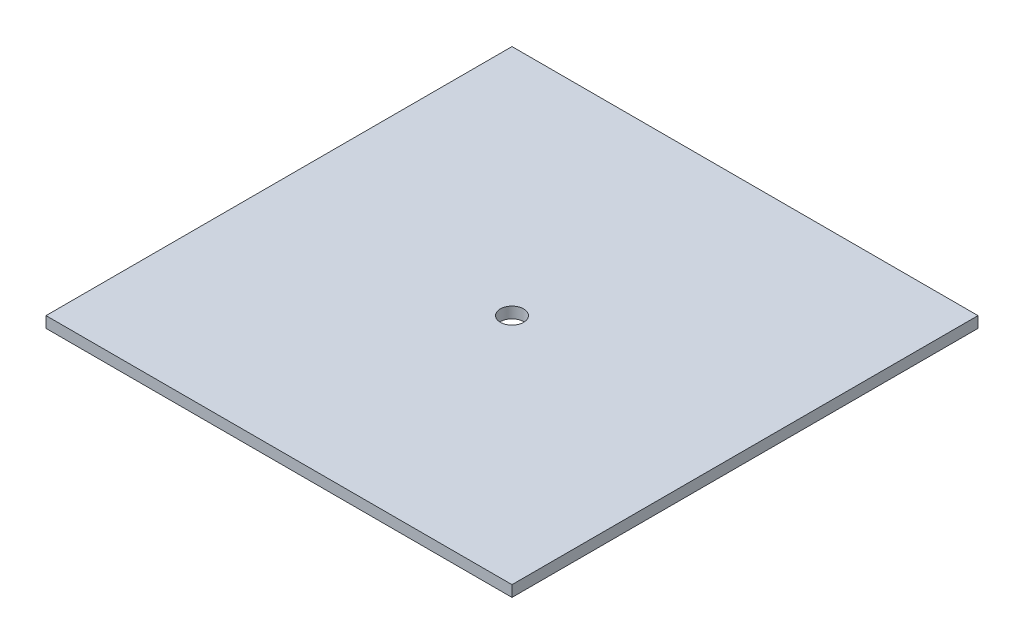
ISO-10303-21;
HEADER;
FILE_DESCRIPTION(('STEP AP214'),'2;1');
FILE_NAME('part.step','',(''),(''),'','','');
FILE_SCHEMA(('AUTOMOTIVE_DESIGN { 1 0 10303 214 1 1 1 1 }'));
ENDSEC;
DATA;
#1=APPLICATION_CONTEXT('core data for automotive mechanical design processes');
#2=APPLICATION_PROTOCOL_DEFINITION('international standard','automotive_design',2000,#1);
#3=PRODUCT_CONTEXT('',#1,'mechanical');
#4=PRODUCT('Part','Part','',(#3));
#5=PRODUCT_RELATED_PRODUCT_CATEGORY('part','',(#4));
#6=PRODUCT_DEFINITION_FORMATION('','',#4);
#7=PRODUCT_DEFINITION_CONTEXT('part definition',#1,'design');
#8=PRODUCT_DEFINITION('design','',#6,#7);
#9=PRODUCT_DEFINITION_SHAPE('','',#8);
#10=(LENGTH_UNIT() NAMED_UNIT(*) SI_UNIT(.MILLI.,.METRE.));
#11=(NAMED_UNIT(*) PLANE_ANGLE_UNIT() SI_UNIT($,.RADIAN.));
#12=(NAMED_UNIT(*) SI_UNIT($,.STERADIAN.) SOLID_ANGLE_UNIT());
#13=UNCERTAINTY_MEASURE_WITH_UNIT(LENGTH_MEASURE(1.E-05),#10,'distance_accuracy_value','');
#14=(GEOMETRIC_REPRESENTATION_CONTEXT(3) GLOBAL_UNCERTAINTY_ASSIGNED_CONTEXT((#13)) GLOBAL_UNIT_ASSIGNED_CONTEXT((#10,
#11,#12)) REPRESENTATION_CONTEXT('',''));
#15=CARTESIAN_POINT('',(0.,0.,0.));
#16=DIRECTION('',(0.,0.,1.));
#17=DIRECTION('',(1.,0.,0.));
#18=AXIS2_PLACEMENT_3D('',#15,#16,#17);
#19=CARTESIAN_POINT('',(0.,4.7625,0.));
#20=DIRECTION('',(0.,1.,0.));
#21=DIRECTION('',(0.,0.,1.));
#22=AXIS2_PLACEMENT_3D('',#19,#20,#21);
#23=PLANE('',#22);
#24=DIRECTION('',(0.,0.,1.));
#25=VECTOR('',#24,1.);
#26=CARTESIAN_POINT('',(-200.,4.7625,-200.));
#27=LINE('',#26,#25);
#28=CARTESIAN_POINT('',(-200.,4.7625,-200.));
#29=VERTEX_POINT('',#28);
#30=CARTESIAN_POINT('',(-200.,4.7625,0.));
#31=VERTEX_POINT('',#30);
#32=EDGE_CURVE('E85',#29,#31,#27,.T.);
#33=ORIENTED_EDGE('',*,*,#32,.T.);
#34=DIRECTION('',(1.,0.,0.));
#35=VECTOR('',#34,1.);
#36=CARTESIAN_POINT('',(-200.,4.7625,0.));
#37=LINE('',#36,#35);
#38=CARTESIAN_POINT('',(0.,4.7625,0.));
#39=VERTEX_POINT('',#38);
#40=EDGE_CURVE('E80',#31,#39,#37,.T.);
#41=ORIENTED_EDGE('',*,*,#40,.T.);
#42=DIRECTION('',(0.,0.,-1.));
#43=VECTOR('',#42,1.);
#44=CARTESIAN_POINT('',(0.,4.7625,-200.));
#45=LINE('',#44,#43);
#46=CARTESIAN_POINT('',(0.,4.7625,-200.));
#47=VERTEX_POINT('',#46);
#48=EDGE_CURVE('E83',#39,#47,#45,.T.);
#49=ORIENTED_EDGE('',*,*,#48,.T.);
#50=DIRECTION('',(-1.,0.,0.));
#51=VECTOR('',#50,1.);
#52=CARTESIAN_POINT('',(-200.,4.7625,-200.));
#53=LINE('',#52,#51);
#54=EDGE_CURVE('E50',#47,#29,#53,.T.);
#55=ORIENTED_EDGE('',*,*,#54,.T.);
#56=EDGE_LOOP('',(#33,#41,#49,#55));
#57=FACE_BOUND('',#56,.T.);
#58=CARTESIAN_POINT('',(-100.,4.7625,-100.));
#59=DIRECTION('',(0.,1.,0.));
#60=DIRECTION('',(0.,0.,1.));
#61=AXIS2_PLACEMENT_3D('',#58,#59,#60);
#62=CIRCLE('',#61,5.00000000000001);
#63=CARTESIAN_POINT('',(-100.,4.7625,-105.));
#64=VERTEX_POINT('',#63);
#65=EDGE_CURVE('E100',#64,#64,#62,.T.);
#66=ORIENTED_EDGE('',*,*,#65,.F.);
#67=EDGE_LOOP('',(#66));
#68=FACE_BOUND('',#67,.T.);
#69=ADVANCED_FACE('F33',(#57,#68),#23,.T.);
#70=CARTESIAN_POINT('',(0.,0.,0.));
#71=DIRECTION('',(0.,1.,0.));
#72=DIRECTION('',(0.,0.,1.));
#73=AXIS2_PLACEMENT_3D('',#70,#71,#72);
#74=PLANE('',#73);
#75=DIRECTION('',(0.,0.,1.));
#76=VECTOR('',#75,1.);
#77=CARTESIAN_POINT('',(-200.,0.,-200.));
#78=LINE('',#77,#76);
#79=CARTESIAN_POINT('',(-200.,0.,-200.));
#80=VERTEX_POINT('',#79);
#81=CARTESIAN_POINT('',(-200.,0.,0.));
#82=VERTEX_POINT('',#81);
#83=EDGE_CURVE('E97',#80,#82,#78,.T.);
#84=ORIENTED_EDGE('',*,*,#83,.F.);
#85=DIRECTION('',(-1.,0.,0.));
#86=VECTOR('',#85,1.);
#87=CARTESIAN_POINT('',(-200.,0.,-200.));
#88=LINE('',#87,#86);
#89=CARTESIAN_POINT('',(0.,0.,-200.));
#90=VERTEX_POINT('',#89);
#91=EDGE_CURVE('E73',#90,#80,#88,.T.);
#92=ORIENTED_EDGE('',*,*,#91,.F.);
#93=DIRECTION('',(0.,0.,-1.));
#94=VECTOR('',#93,1.);
#95=CARTESIAN_POINT('',(0.,0.,-200.));
#96=LINE('',#95,#94);
#97=CARTESIAN_POINT('',(0.,0.,0.));
#98=VERTEX_POINT('',#97);
#99=EDGE_CURVE('E67',#98,#90,#96,.T.);
#100=ORIENTED_EDGE('',*,*,#99,.F.);
#101=DIRECTION('',(1.,0.,0.));
#102=VECTOR('',#101,1.);
#103=CARTESIAN_POINT('',(-200.,0.,0.));
#104=LINE('',#103,#102);
#105=EDGE_CURVE('E89',#82,#98,#104,.T.);
#106=ORIENTED_EDGE('',*,*,#105,.F.);
#107=EDGE_LOOP('',(#84,#92,#100,#106));
#108=FACE_BOUND('',#107,.T.);
#109=CARTESIAN_POINT('',(-100.,0.,-100.));
#110=DIRECTION('',(0.,1.,0.));
#111=DIRECTION('',(0.,0.,1.));
#112=AXIS2_PLACEMENT_3D('',#109,#110,#111);
#113=CIRCLE('',#112,5.00000000000001);
#114=CARTESIAN_POINT('',(-100.,0.,-105.));
#115=VERTEX_POINT('',#114);
#116=EDGE_CURVE('E112',#115,#115,#113,.T.);
#117=ORIENTED_EDGE('',*,*,#116,.T.);
#118=EDGE_LOOP('',(#117));
#119=FACE_BOUND('',#118,.T.);
#120=ADVANCED_FACE('F108',(#108,#119),#74,.F.);
#121=CARTESIAN_POINT('',(-200.,4.7625,-200.));
#122=DIRECTION('',(1.,0.,0.));
#123=DIRECTION('',(0.,0.,-1.));
#124=AXIS2_PLACEMENT_3D('',#121,#122,#123);
#125=PLANE('',#124);
#126=ORIENTED_EDGE('',*,*,#83,.T.);
#127=DIRECTION('',(0.,-1.,0.));
#128=VECTOR('',#127,1.);
#129=CARTESIAN_POINT('',(-200.,4.7625,0.));
#130=LINE('',#129,#128);
#131=EDGE_CURVE('E11',#31,#82,#130,.T.);
#132=ORIENTED_EDGE('',*,*,#131,.F.);
#133=ORIENTED_EDGE('',*,*,#32,.F.);
#134=DIRECTION('',(0.,-1.,0.));
#135=VECTOR('',#134,1.);
#136=CARTESIAN_POINT('',(-200.,4.7625,-200.));
#137=LINE('',#136,#135);
#138=EDGE_CURVE('E93',#29,#80,#137,.T.);
#139=ORIENTED_EDGE('',*,*,#138,.T.);
#140=EDGE_LOOP('',(#126,#132,#133,#139));
#141=FACE_BOUND('',#140,.T.);
#142=ADVANCED_FACE('F35',(#141),#125,.F.);
#143=CARTESIAN_POINT('',(-200.,4.7625,0.));
#144=DIRECTION('',(0.,0.,-1.));
#145=DIRECTION('',(-1.,0.,0.));
#146=AXIS2_PLACEMENT_3D('',#143,#144,#145);
#147=PLANE('',#146);
#148=ORIENTED_EDGE('',*,*,#105,.T.);
#149=DIRECTION('',(0.,-1.,0.));
#150=VECTOR('',#149,1.);
#151=CARTESIAN_POINT('',(0.,4.7625,0.));
#152=LINE('',#151,#150);
#153=EDGE_CURVE('E42',#39,#98,#152,.T.);
#154=ORIENTED_EDGE('',*,*,#153,.F.);
#155=ORIENTED_EDGE('',*,*,#40,.F.);
#156=ORIENTED_EDGE('',*,*,#131,.T.);
#157=EDGE_LOOP('',(#148,#154,#155,#156));
#158=FACE_BOUND('',#157,.T.);
#159=ADVANCED_FACE('F88',(#158),#147,.F.);
#160=CARTESIAN_POINT('',(0.,4.7625,-200.));
#161=DIRECTION('',(-1.,0.,0.));
#162=DIRECTION('',(0.,0.,1.));
#163=AXIS2_PLACEMENT_3D('',#160,#161,#162);
#164=PLANE('',#163);
#165=ORIENTED_EDGE('',*,*,#99,.T.);
#166=DIRECTION('',(0.,-1.,0.));
#167=VECTOR('',#166,1.);
#168=CARTESIAN_POINT('',(0.,4.7625,-200.));
#169=LINE('',#168,#167);
#170=EDGE_CURVE('E90',#47,#90,#169,.T.);
#171=ORIENTED_EDGE('',*,*,#170,.F.);
#172=ORIENTED_EDGE('',*,*,#48,.F.);
#173=ORIENTED_EDGE('',*,*,#153,.T.);
#174=EDGE_LOOP('',(#165,#171,#172,#173));
#175=FACE_BOUND('',#174,.T.);
#176=ADVANCED_FACE('F91',(#175),#164,.F.);
#177=CARTESIAN_POINT('',(-200.,4.7625,-200.));
#178=DIRECTION('',(0.,0.,1.));
#179=DIRECTION('',(1.,0.,0.));
#180=AXIS2_PLACEMENT_3D('',#177,#178,#179);
#181=PLANE('',#180);
#182=ORIENTED_EDGE('',*,*,#91,.T.);
#183=ORIENTED_EDGE('',*,*,#138,.F.);
#184=ORIENTED_EDGE('',*,*,#54,.F.);
#185=ORIENTED_EDGE('',*,*,#170,.T.);
#186=EDGE_LOOP('',(#182,#183,#184,#185));
#187=FACE_BOUND('',#186,.T.);
#188=ADVANCED_FACE('F105',(#187),#181,.F.);
#189=CARTESIAN_POINT('',(-100.,4.7625,-100.));
#190=DIRECTION('',(0.,-1.,0.));
#191=DIRECTION('',(0.,0.,-1.));
#192=AXIS2_PLACEMENT_3D('',#189,#190,#191);
#193=CYLINDRICAL_SURFACE('',#192,5.00000000000001);
#194=CARTESIAN_POINT('',(-100.,4.7625,-105.));
#195=CARTESIAN_POINT('',(-100.,4.712890625,-105.));
#196=CARTESIAN_POINT('',(-100.,4.66328125,-105.));
#197=CARTESIAN_POINT('',(-100.,4.5640625,-105.));
#198=CARTESIAN_POINT('',(-100.,4.514453125,-105.));
#199=CARTESIAN_POINT('',(-100.,4.415234375,-105.));
#200=CARTESIAN_POINT('',(-100.,4.365625,-105.));
#201=CARTESIAN_POINT('',(-100.,4.26640625,-105.));
#202=CARTESIAN_POINT('',(-100.,4.216796875,-105.));
#203=CARTESIAN_POINT('',(-100.,4.117578125,-105.));
#204=CARTESIAN_POINT('',(-100.,4.06796875,-105.));
#205=CARTESIAN_POINT('',(-100.,3.96875,-105.));
#206=CARTESIAN_POINT('',(-100.,3.919140625,-105.));
#207=CARTESIAN_POINT('',(-100.,3.819921875,-105.));
#208=CARTESIAN_POINT('',(-100.,3.7703125,-105.));
#209=CARTESIAN_POINT('',(-100.,3.67109375,-105.));
#210=CARTESIAN_POINT('',(-100.,3.621484375,-105.));
#211=CARTESIAN_POINT('',(-100.,3.522265625,-105.));
#212=CARTESIAN_POINT('',(-100.,3.47265625,-105.));
#213=CARTESIAN_POINT('',(-100.,3.3734375,-105.));
#214=CARTESIAN_POINT('',(-100.,3.323828125,-105.));
#215=CARTESIAN_POINT('',(-100.,3.224609375,-105.));
#216=CARTESIAN_POINT('',(-100.,3.175,-105.));
#217=CARTESIAN_POINT('',(-100.,3.07578125,-105.));
#218=CARTESIAN_POINT('',(-100.,3.026171875,-105.));
#219=CARTESIAN_POINT('',(-100.,2.926953125,-105.));
#220=CARTESIAN_POINT('',(-100.,2.87734375,-105.));
#221=CARTESIAN_POINT('',(-100.,2.778125,-105.));
#222=CARTESIAN_POINT('',(-100.,2.728515625,-105.));
#223=CARTESIAN_POINT('',(-100.,2.629296875,-105.));
#224=CARTESIAN_POINT('',(-100.,2.5796875,-105.));
#225=CARTESIAN_POINT('',(-100.,2.48046875,-105.));
#226=CARTESIAN_POINT('',(-100.,2.430859375,-105.));
#227=CARTESIAN_POINT('',(-100.,2.331640625,-105.));
#228=CARTESIAN_POINT('',(-100.,2.28203125,-105.));
#229=CARTESIAN_POINT('',(-100.,2.1828125,-105.));
#230=CARTESIAN_POINT('',(-100.,2.133203125,-105.));
#231=CARTESIAN_POINT('',(-100.,2.033984375,-105.));
#232=CARTESIAN_POINT('',(-100.,1.984375,-105.));
#233=CARTESIAN_POINT('',(-100.,1.88515625,-105.));
#234=CARTESIAN_POINT('',(-100.,1.835546875,-105.));
#235=CARTESIAN_POINT('',(-100.,1.736328125,-105.));
#236=CARTESIAN_POINT('',(-100.,1.68671875,-105.));
#237=CARTESIAN_POINT('',(-100.,1.5875,-105.));
#238=CARTESIAN_POINT('',(-100.,1.537890625,-105.));
#239=CARTESIAN_POINT('',(-100.,1.438671875,-105.));
#240=CARTESIAN_POINT('',(-100.,1.3890625,-105.));
#241=CARTESIAN_POINT('',(-100.,1.28984375,-105.));
#242=CARTESIAN_POINT('',(-100.,1.240234375,-105.));
#243=CARTESIAN_POINT('',(-100.,1.141015625,-105.));
#244=CARTESIAN_POINT('',(-100.,1.09140625,-105.));
#245=CARTESIAN_POINT('',(-100.,0.9921875,-105.));
#246=CARTESIAN_POINT('',(-100.,0.942578125,-105.));
#247=CARTESIAN_POINT('',(-100.,0.843359375,-105.));
#248=CARTESIAN_POINT('',(-100.,0.79375,-105.));
#249=CARTESIAN_POINT('',(-100.,0.69453125,-105.));
#250=CARTESIAN_POINT('',(-100.,0.644921875,-105.));
#251=CARTESIAN_POINT('',(-100.,0.545703125,-105.));
#252=CARTESIAN_POINT('',(-100.,0.49609375,-105.));
#253=CARTESIAN_POINT('',(-100.,0.396875,-105.));
#254=CARTESIAN_POINT('',(-100.,0.347265625,-105.));
#255=CARTESIAN_POINT('',(-100.,0.248046875,-105.));
#256=CARTESIAN_POINT('',(-100.,0.1984375,-105.));
#257=CARTESIAN_POINT('',(-100.,0.09921875,-105.));
#258=CARTESIAN_POINT('',(-100.,0.049609375,-105.));
#259=CARTESIAN_POINT('',(-100.,0.,-105.));
#260=B_SPLINE_CURVE_WITH_KNOTS('',3,(#194,#195,#196,#197,#198,#199,#200,#201,#202,#203,#204,
#205,#206,#207,#208,#209,#210,#211,#212,#213,#214,#215,#216,#217,#218,#219,#220,#221,#222,#223,
#224,#225,#226,#227,#228,#229,#230,#231,#232,#233,#234,#235,#236,#237,#238,#239,#240,#241,#242,
#243,#244,#245,#246,#247,#248,#249,#250,#251,#252,#253,#254,#255,#256,#257,#258,#259),
.UNSPECIFIED.,.F.,.F.,(4,2,2,2,2,2,2,2,2,2,2,2,2,2,2,2,2,2,2,2,2,2,2,2,2,2,2,2,2,2,2,2,4),(0.,
0.148828124999999,0.297656249999999,0.446484374999999,0.595312499999999,0.744140625,0.89296875,
1.041796875,1.190625,1.339453125,1.48828125,1.637109375,1.7859375,1.934765625,2.08359375,
2.232421875,2.38125,2.530078125,2.67890625,2.827734375,2.9765625,3.125390625,3.27421875,
3.423046875,3.571875,3.720703125,3.86953125,4.018359375,4.1671875,4.316015625,4.46484375,
4.613671875,4.7625),.UNSPECIFIED.);
#261=EDGE_CURVE('BSEAM118',#64,#115,#260,.T.);
#262=ORIENTED_EDGE('',*,*,#65,.T.);
#263=ORIENTED_EDGE('',*,*,#116,.F.);
#264=ORIENTED_EDGE('',*,*,#261,.T.);
#265=ORIENTED_EDGE('',*,*,#261,.F.);
#266=EDGE_LOOP('',(#262,#264,#263,#265));
#267=FACE_BOUND('',#266,.T.);
#268=ADVANCED_FACE('F118',(#267),#193,.F.);
#269=CLOSED_SHELL('',(#69,#120,#142,#159,#176,#188,#268));
#270=MANIFOLD_SOLID_BREP('B2',#269);
#271=ADVANCED_BREP_SHAPE_REPRESENTATION('',(#18,#270),#14);
#272=SHAPE_DEFINITION_REPRESENTATION(#9,#271);
ENDSEC;
END-ISO-10303-21;
